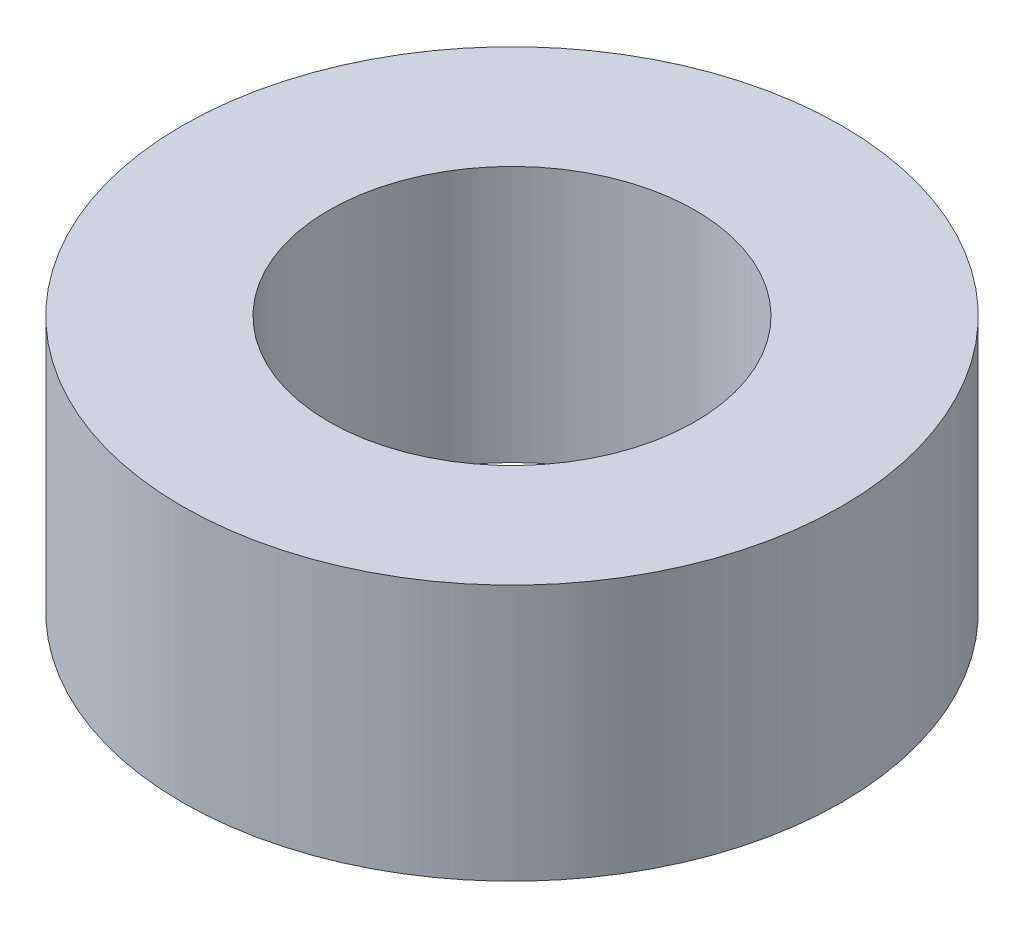
ISO-10303-21;
HEADER;
FILE_DESCRIPTION(('STEP AP214'),'2;1');
FILE_NAME('part.step','',(''),(''),'','','');
FILE_SCHEMA(('AUTOMOTIVE_DESIGN { 1 0 10303 214 1 1 1 1 }'));
ENDSEC;
DATA;
#1=APPLICATION_CONTEXT('core data for automotive mechanical design processes');
#2=APPLICATION_PROTOCOL_DEFINITION('international standard','automotive_design',2000,#1);
#3=PRODUCT_CONTEXT('',#1,'mechanical');
#4=PRODUCT('Part','Part','',(#3));
#5=PRODUCT_RELATED_PRODUCT_CATEGORY('part','',(#4));
#6=PRODUCT_DEFINITION_FORMATION('','',#4);
#7=PRODUCT_DEFINITION_CONTEXT('part definition',#1,'design');
#8=PRODUCT_DEFINITION('design','',#6,#7);
#9=PRODUCT_DEFINITION_SHAPE('','',#8);
#10=(LENGTH_UNIT() NAMED_UNIT(*) SI_UNIT(.MILLI.,.METRE.));
#11=(NAMED_UNIT(*) PLANE_ANGLE_UNIT() SI_UNIT($,.RADIAN.));
#12=(NAMED_UNIT(*) SI_UNIT($,.STERADIAN.) SOLID_ANGLE_UNIT());
#13=UNCERTAINTY_MEASURE_WITH_UNIT(LENGTH_MEASURE(1.E-05),#10,'distance_accuracy_value','');
#14=(GEOMETRIC_REPRESENTATION_CONTEXT(3) GLOBAL_UNCERTAINTY_ASSIGNED_CONTEXT((#13)) GLOBAL_UNIT_ASSIGNED_CONTEXT((#10,
#11,#12)) REPRESENTATION_CONTEXT('',''));
#15=CARTESIAN_POINT('',(0.,0.,0.));
#16=DIRECTION('',(0.,0.,1.));
#17=DIRECTION('',(1.,0.,0.));
#18=AXIS2_PLACEMENT_3D('',#15,#16,#17);
#19=CARTESIAN_POINT('',(0.,5.42299069813371,0.));
#20=DIRECTION('',(0.,1.,0.));
#21=DIRECTION('',(0.,0.,1.));
#22=AXIS2_PLACEMENT_3D('',#19,#20,#21);
#23=CYLINDRICAL_SURFACE('',#22,2.5);
#24=CARTESIAN_POINT('',(0.,-1.75,0.));
#25=DIRECTION('',(0.,1.,0.));
#26=DIRECTION('',(0.,0.,1.));
#27=AXIS2_PLACEMENT_3D('',#24,#25,#26);
#28=CIRCLE('',#27,2.5);
#29=CARTESIAN_POINT('',(0.,-1.75,2.5));
#30=VERTEX_POINT('',#29);
#31=EDGE_CURVE('E10',#30,#30,#28,.T.);
#32=ORIENTED_EDGE('',*,*,#31,.F.);
#33=EDGE_LOOP('',(#32));
#34=FACE_BOUND('',#33,.T.);
#35=CARTESIAN_POINT('',(0.,1.75,0.));
#36=DIRECTION('',(0.,1.,0.));
#37=DIRECTION('',(0.,0.,1.));
#38=AXIS2_PLACEMENT_3D('',#35,#36,#37);
#39=CIRCLE('',#38,2.5);
#40=CARTESIAN_POINT('',(0.,1.75,2.5));
#41=VERTEX_POINT('',#40);
#42=EDGE_CURVE('E45',#41,#41,#39,.T.);
#43=ORIENTED_EDGE('',*,*,#42,.T.);
#44=EDGE_LOOP('',(#43));
#45=FACE_BOUND('',#44,.T.);
#46=ADVANCED_FACE('F31',(#34,#45),#23,.F.);
#47=CARTESIAN_POINT('',(0.,-1.75,-2.5));
#48=DIRECTION('',(0.,1.,0.));
#49=DIRECTION('',(0.,0.,1.));
#50=AXIS2_PLACEMENT_3D('',#47,#48,#49);
#51=PLANE('',#50);
#52=CARTESIAN_POINT('',(0.,-1.75,0.));
#53=DIRECTION('',(0.,1.,0.));
#54=DIRECTION('',(0.,0.,1.));
#55=AXIS2_PLACEMENT_3D('',#52,#53,#54);
#56=CIRCLE('',#55,4.5);
#57=CARTESIAN_POINT('',(0.,-1.75,4.5));
#58=VERTEX_POINT('',#57);
#59=EDGE_CURVE('E37',#58,#58,#56,.T.);
#60=ORIENTED_EDGE('',*,*,#59,.F.);
#61=EDGE_LOOP('',(#60));
#62=FACE_BOUND('',#61,.T.);
#63=ORIENTED_EDGE('',*,*,#31,.T.);
#64=EDGE_LOOP('',(#63));
#65=FACE_BOUND('',#64,.T.);
#66=ADVANCED_FACE('F60',(#62,#65),#51,.F.);
#67=CARTESIAN_POINT('',(0.,5.42299069813371,0.));
#68=DIRECTION('',(0.,1.,0.));
#69=DIRECTION('',(0.,0.,1.));
#70=AXIS2_PLACEMENT_3D('',#67,#68,#69);
#71=CYLINDRICAL_SURFACE('',#70,4.5);
#72=CARTESIAN_POINT('',(0.,1.75,0.));
#73=DIRECTION('',(0.,1.,0.));
#74=DIRECTION('',(0.,0.,1.));
#75=AXIS2_PLACEMENT_3D('',#72,#73,#74);
#76=CIRCLE('',#75,4.5);
#77=CARTESIAN_POINT('',(0.,1.75,4.5));
#78=VERTEX_POINT('',#77);
#79=EDGE_CURVE('E41',#78,#78,#76,.T.);
#80=ORIENTED_EDGE('',*,*,#79,.F.);
#81=EDGE_LOOP('',(#80));
#82=FACE_BOUND('',#81,.T.);
#83=ORIENTED_EDGE('',*,*,#59,.T.);
#84=EDGE_LOOP('',(#83));
#85=FACE_BOUND('',#84,.T.);
#86=ADVANCED_FACE('F55',(#82,#85),#71,.T.);
#87=CARTESIAN_POINT('',(0.,1.75,-2.5));
#88=DIRECTION('',(0.,-1.,0.));
#89=DIRECTION('',(0.,0.,-1.));
#90=AXIS2_PLACEMENT_3D('',#87,#88,#89);
#91=PLANE('',#90);
#92=ORIENTED_EDGE('',*,*,#42,.F.);
#93=EDGE_LOOP('',(#92));
#94=FACE_BOUND('',#93,.T.);
#95=ORIENTED_EDGE('',*,*,#79,.T.);
#96=EDGE_LOOP('',(#95));
#97=FACE_BOUND('',#96,.T.);
#98=ADVANCED_FACE('F52',(#94,#97),#91,.F.);
#99=CLOSED_SHELL('',(#46,#66,#86,#98));
#100=MANIFOLD_SOLID_BREP('B2',#99);
#101=ADVANCED_BREP_SHAPE_REPRESENTATION('',(#18,#100),#14);
#102=SHAPE_DEFINITION_REPRESENTATION(#9,#101);
ENDSEC;
END-ISO-10303-21;
